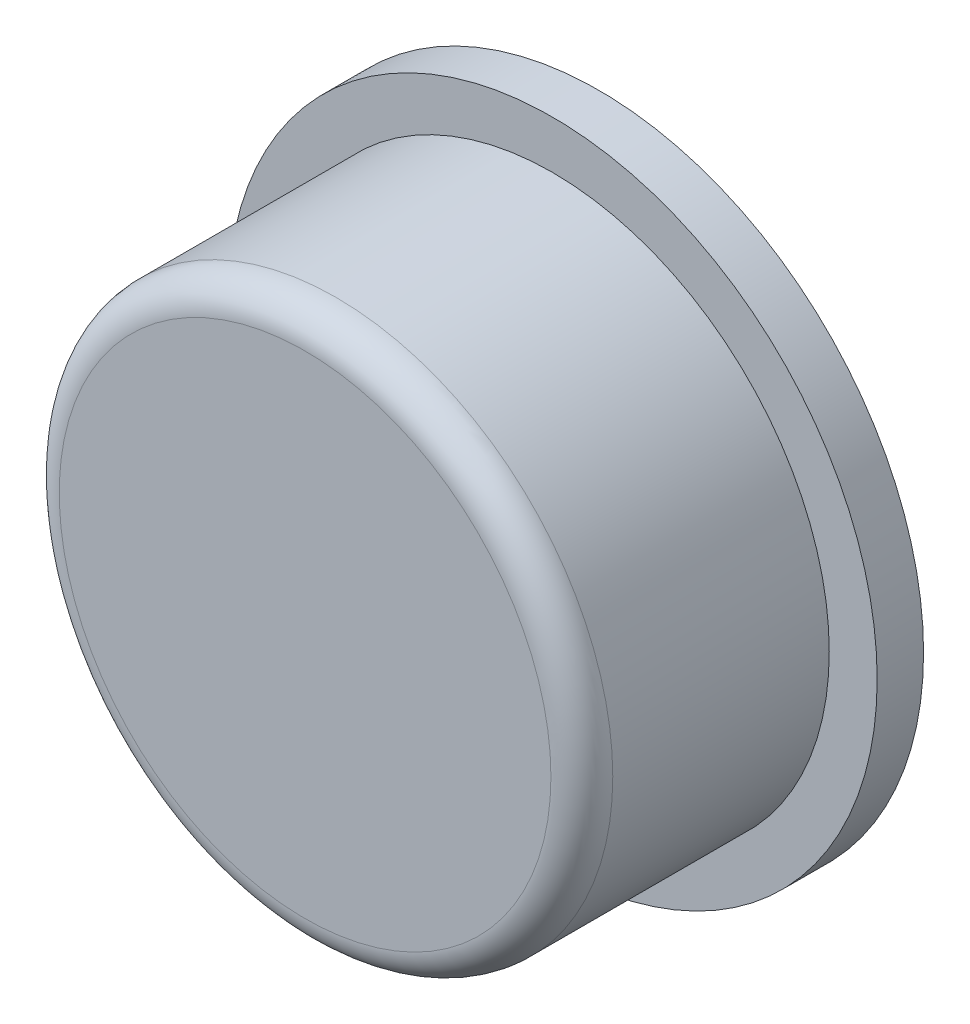
ISO-10303-21;
HEADER;
FILE_DESCRIPTION(('STEP AP214'),'2;1');
FILE_NAME('part.step','',(''),(''),'','','');
FILE_SCHEMA(('AUTOMOTIVE_DESIGN { 1 0 10303 214 1 1 1 1 }'));
ENDSEC;
DATA;
#1=APPLICATION_CONTEXT('core data for automotive mechanical design processes');
#2=APPLICATION_PROTOCOL_DEFINITION('international standard','automotive_design',2000,#1);
#3=PRODUCT_CONTEXT('',#1,'mechanical');
#4=PRODUCT('Part','Part','',(#3));
#5=PRODUCT_RELATED_PRODUCT_CATEGORY('part','',(#4));
#6=PRODUCT_DEFINITION_FORMATION('','',#4);
#7=PRODUCT_DEFINITION_CONTEXT('part definition',#1,'design');
#8=PRODUCT_DEFINITION('design','',#6,#7);
#9=PRODUCT_DEFINITION_SHAPE('','',#8);
#10=(LENGTH_UNIT() NAMED_UNIT(*) SI_UNIT(.MILLI.,.METRE.));
#11=(NAMED_UNIT(*) PLANE_ANGLE_UNIT() SI_UNIT($,.RADIAN.));
#12=(NAMED_UNIT(*) SI_UNIT($,.STERADIAN.) SOLID_ANGLE_UNIT());
#13=UNCERTAINTY_MEASURE_WITH_UNIT(LENGTH_MEASURE(1.E-05),#10,'distance_accuracy_value','');
#14=(GEOMETRIC_REPRESENTATION_CONTEXT(3) GLOBAL_UNCERTAINTY_ASSIGNED_CONTEXT((#13)) GLOBAL_UNIT_ASSIGNED_CONTEXT((#10,
#11,#12)) REPRESENTATION_CONTEXT('',''));
#15=CARTESIAN_POINT('',(0.,0.,0.));
#16=DIRECTION('',(0.,0.,1.));
#17=DIRECTION('',(1.,0.,0.));
#18=AXIS2_PLACEMENT_3D('',#15,#16,#17);
#19=CARTESIAN_POINT('',(0.,0.,0.));
#20=DIRECTION('',(0.,0.,1.));
#21=DIRECTION('',(1.,0.,0.));
#22=AXIS2_PLACEMENT_3D('',#19,#20,#21);
#23=PLANE('',#22);
#24=CARTESIAN_POINT('',(0.,0.,0.));
#25=DIRECTION('',(0.,0.,1.));
#26=DIRECTION('',(1.,0.,0.));
#27=AXIS2_PLACEMENT_3D('',#24,#25,#26);
#28=CIRCLE('',#27,7.94999999999999);
#29=CARTESIAN_POINT('',(7.94999999999999,0.,0.));
#30=VERTEX_POINT('',#29);
#31=EDGE_CURVE('E12',#30,#30,#28,.T.);
#32=ORIENTED_EDGE('',*,*,#31,.T.);
#33=EDGE_LOOP('',(#32));
#34=FACE_BOUND('',#33,.T.);
#35=ADVANCED_FACE('F41',(#34),#23,.T.);
#36=CARTESIAN_POINT('',(0.,0.,-1.));
#37=DIRECTION('',(0.,0.,1.));
#38=DIRECTION('',(1.,0.,0.));
#39=AXIS2_PLACEMENT_3D('',#36,#37,#38);
#40=TOROIDAL_SURFACE('',#39,7.95,1.);
#41=CARTESIAN_POINT('',(0.,0.,-1.00000000000001));
#42=DIRECTION('',(0.,0.,1.));
#43=DIRECTION('',(1.,0.,0.));
#44=AXIS2_PLACEMENT_3D('',#41,#42,#43);
#45=CIRCLE('',#44,8.95);
#46=CARTESIAN_POINT('',(8.95,0.,-1.00000000000001));
#47=VERTEX_POINT('',#46);
#48=EDGE_CURVE('E47',#47,#47,#45,.T.);
#49=ORIENTED_EDGE('',*,*,#48,.T.);
#50=EDGE_LOOP('',(#49));
#51=FACE_BOUND('',#50,.T.);
#52=ORIENTED_EDGE('',*,*,#31,.F.);
#53=EDGE_LOOP('',(#52));
#54=FACE_BOUND('',#53,.T.);
#55=ADVANCED_FACE('F79',(#51,#54),#40,.T.);
#56=CARTESIAN_POINT('',(0.,0.,0.));
#57=DIRECTION('',(0.,0.,1.));
#58=DIRECTION('',(1.,0.,0.));
#59=AXIS2_PLACEMENT_3D('',#56,#57,#58);
#60=CYLINDRICAL_SURFACE('',#59,8.95);
#61=CARTESIAN_POINT('',(0.,0.,-8.));
#62=DIRECTION('',(0.,0.,1.));
#63=DIRECTION('',(1.,0.,0.));
#64=AXIS2_PLACEMENT_3D('',#61,#62,#63);
#65=CIRCLE('',#64,8.95);
#66=CARTESIAN_POINT('',(8.95,0.,-8.));
#67=VERTEX_POINT('',#66);
#68=EDGE_CURVE('E51',#67,#67,#65,.T.);
#69=ORIENTED_EDGE('',*,*,#68,.T.);
#70=EDGE_LOOP('',(#69));
#71=FACE_BOUND('',#70,.T.);
#72=ORIENTED_EDGE('',*,*,#48,.F.);
#73=EDGE_LOOP('',(#72));
#74=FACE_BOUND('',#73,.T.);
#75=ADVANCED_FACE('F83',(#71,#74),#60,.T.);
#76=CARTESIAN_POINT('',(8.95,0.,-8.));
#77=DIRECTION('',(0.,0.,1.));
#78=DIRECTION('',(1.,0.,0.));
#79=AXIS2_PLACEMENT_3D('',#76,#77,#78);
#80=PLANE('',#79);
#81=CARTESIAN_POINT('',(0.,0.,-8.));
#82=DIRECTION('',(0.,0.,1.));
#83=DIRECTION('',(1.,0.,0.));
#84=AXIS2_PLACEMENT_3D('',#81,#82,#83);
#85=CIRCLE('',#84,10.5);
#86=CARTESIAN_POINT('',(10.5,0.,-8.));
#87=VERTEX_POINT('',#86);
#88=EDGE_CURVE('E55',#87,#87,#85,.T.);
#89=ORIENTED_EDGE('',*,*,#88,.T.);
#90=EDGE_LOOP('',(#89));
#91=FACE_BOUND('',#90,.T.);
#92=ORIENTED_EDGE('',*,*,#68,.F.);
#93=EDGE_LOOP('',(#92));
#94=FACE_BOUND('',#93,.T.);
#95=ADVANCED_FACE('F87',(#91,#94),#80,.T.);
#96=CARTESIAN_POINT('',(0.,0.,0.));
#97=DIRECTION('',(0.,0.,1.));
#98=DIRECTION('',(1.,0.,0.));
#99=AXIS2_PLACEMENT_3D('',#96,#97,#98);
#100=CYLINDRICAL_SURFACE('',#99,10.5);
#101=CARTESIAN_POINT('',(0.,0.,-9.5));
#102=DIRECTION('',(0.,0.,1.));
#103=DIRECTION('',(1.,0.,0.));
#104=AXIS2_PLACEMENT_3D('',#101,#102,#103);
#105=CIRCLE('',#104,10.5);
#106=CARTESIAN_POINT('',(10.5,0.,-9.5));
#107=VERTEX_POINT('',#106);
#108=EDGE_CURVE('E60',#107,#107,#105,.T.);
#109=ORIENTED_EDGE('',*,*,#108,.T.);
#110=EDGE_LOOP('',(#109));
#111=FACE_BOUND('',#110,.T.);
#112=ORIENTED_EDGE('',*,*,#88,.F.);
#113=EDGE_LOOP('',(#112));
#114=FACE_BOUND('',#113,.T.);
#115=ADVANCED_FACE('F76',(#111,#114),#100,.T.);
#116=CARTESIAN_POINT('',(10.5,0.,-9.5));
#117=DIRECTION('',(0.,0.,-1.));
#118=DIRECTION('',(-1.,0.,0.));
#119=AXIS2_PLACEMENT_3D('',#116,#117,#118);
#120=PLANE('',#119);
#121=CARTESIAN_POINT('',(0.,0.,-9.5));
#122=DIRECTION('',(0.,0.,1.));
#123=DIRECTION('',(1.,0.,0.));
#124=AXIS2_PLACEMENT_3D('',#121,#122,#123);
#125=CIRCLE('',#124,3.70809924354783);
#126=CARTESIAN_POINT('',(3.70809924354783,0.,-9.5));
#127=VERTEX_POINT('',#126);
#128=EDGE_CURVE('E63',#127,#127,#125,.T.);
#129=ORIENTED_EDGE('',*,*,#128,.T.);
#130=EDGE_LOOP('',(#129));
#131=FACE_BOUND('',#130,.T.);
#132=ORIENTED_EDGE('',*,*,#108,.F.);
#133=EDGE_LOOP('',(#132));
#134=FACE_BOUND('',#133,.T.);
#135=ADVANCED_FACE('F67',(#131,#134),#120,.T.);
#136=CARTESIAN_POINT('',(0.,0.,-8.));
#137=DIRECTION('',(0.,0.,1.));
#138=DIRECTION('',(1.,0.,0.));
#139=AXIS2_PLACEMENT_3D('',#136,#137,#138);
#140=SPHERICAL_SURFACE('',#139,4.);
#141=ORIENTED_EDGE('',*,*,#128,.F.);
#142=EDGE_LOOP('',(#141));
#143=FACE_BOUND('',#142,.T.);
#144=ADVANCED_FACE('F70',(#143),#140,.T.);
#145=CLOSED_SHELL('',(#35,#55,#75,#95,#115,#135,#144));
#146=MANIFOLD_SOLID_BREP('B2',#145);
#147=ADVANCED_BREP_SHAPE_REPRESENTATION('',(#18,#146),#14);
#148=SHAPE_DEFINITION_REPRESENTATION(#9,#147);
ENDSEC;
END-ISO-10303-21;
